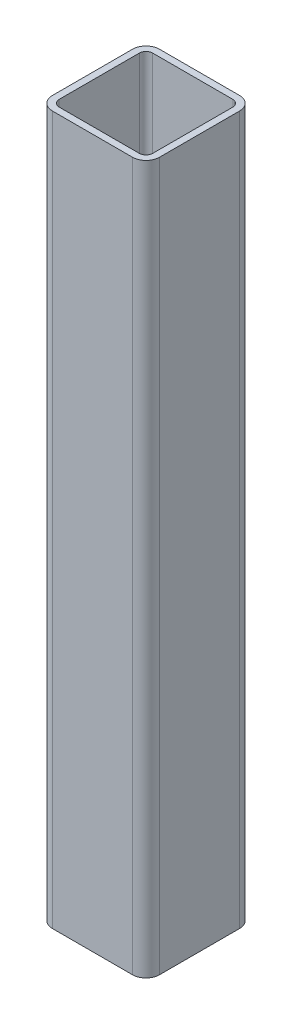
ISO-10303-21;
HEADER;
FILE_DESCRIPTION(('STEP AP214'),'2;1');
FILE_NAME('part.step','',(''),(''),'','','');
FILE_SCHEMA(('AUTOMOTIVE_DESIGN { 1 0 10303 214 1 1 1 1 }'));
ENDSEC;
DATA;
#1=APPLICATION_CONTEXT('core data for automotive mechanical design processes');
#2=APPLICATION_PROTOCOL_DEFINITION('international standard','automotive_design',2000,#1);
#3=PRODUCT_CONTEXT('',#1,'mechanical');
#4=PRODUCT('Part','Part','',(#3));
#5=PRODUCT_RELATED_PRODUCT_CATEGORY('part','',(#4));
#6=PRODUCT_DEFINITION_FORMATION('','',#4);
#7=PRODUCT_DEFINITION_CONTEXT('part definition',#1,'design');
#8=PRODUCT_DEFINITION('design','',#6,#7);
#9=PRODUCT_DEFINITION_SHAPE('','',#8);
#10=(LENGTH_UNIT() NAMED_UNIT(*) SI_UNIT(.MILLI.,.METRE.));
#11=(NAMED_UNIT(*) PLANE_ANGLE_UNIT() SI_UNIT($,.RADIAN.));
#12=(NAMED_UNIT(*) SI_UNIT($,.STERADIAN.) SOLID_ANGLE_UNIT());
#13=UNCERTAINTY_MEASURE_WITH_UNIT(LENGTH_MEASURE(1.E-05),#10,'distance_accuracy_value','');
#14=(GEOMETRIC_REPRESENTATION_CONTEXT(3) GLOBAL_UNCERTAINTY_ASSIGNED_CONTEXT((#13)) GLOBAL_UNIT_ASSIGNED_CONTEXT((#10,
#11,#12)) REPRESENTATION_CONTEXT('',''));
#15=CARTESIAN_POINT('',(0.,0.,0.));
#16=DIRECTION('',(0.,0.,1.));
#17=DIRECTION('',(1.,0.,0.));
#18=AXIS2_PLACEMENT_3D('',#15,#16,#17);
#19=CARTESIAN_POINT('',(11.875,210.,-11.875));
#20=DIRECTION('',(0.,-1.,0.));
#21=DIRECTION('',(0.,0.,-1.));
#22=AXIS2_PLACEMENT_3D('',#19,#20,#21);
#23=CYLINDRICAL_SURFACE('',#22,4.);
#24=CARTESIAN_POINT('',(11.875,0.,-11.875));
#25=DIRECTION('',(0.,1.,0.));
#26=DIRECTION('',(0.,0.,1.));
#27=AXIS2_PLACEMENT_3D('',#24,#25,#26);
#28=CIRCLE('',#27,4.);
#29=CARTESIAN_POINT('',(15.875,0.,-11.875));
#30=VERTEX_POINT('',#29);
#31=CARTESIAN_POINT('',(11.875,0.,-15.875));
#32=VERTEX_POINT('',#31);
#33=EDGE_CURVE('E239',#30,#32,#28,.T.);
#34=ORIENTED_EDGE('',*,*,#33,.T.);
#35=DIRECTION('',(0.,-1.,0.));
#36=VECTOR('',#35,1.);
#37=CARTESIAN_POINT('',(11.875,210.,-15.875));
#38=LINE('',#37,#36);
#39=CARTESIAN_POINT('',(11.875,210.,-15.875));
#40=VERTEX_POINT('',#39);
#41=EDGE_CURVE('E12',#40,#32,#38,.T.);
#42=ORIENTED_EDGE('',*,*,#41,.F.);
#43=CARTESIAN_POINT('',(11.875,210.,-11.875));
#44=DIRECTION('',(0.,1.,0.));
#45=DIRECTION('',(0.,0.,1.));
#46=AXIS2_PLACEMENT_3D('',#43,#44,#45);
#47=CIRCLE('',#46,4.);
#48=CARTESIAN_POINT('',(15.875,210.,-11.875));
#49=VERTEX_POINT('',#48);
#50=EDGE_CURVE('E317',#49,#40,#47,.T.);
#51=ORIENTED_EDGE('',*,*,#50,.F.);
#52=DIRECTION('',(0.,-1.,0.));
#53=VECTOR('',#52,1.);
#54=CARTESIAN_POINT('',(15.875,210.,-11.875));
#55=LINE('',#54,#53);
#56=EDGE_CURVE('E254',#49,#30,#55,.T.);
#57=ORIENTED_EDGE('',*,*,#56,.T.);
#58=EDGE_LOOP('',(#34,#42,#51,#57));
#59=FACE_BOUND('',#58,.T.);
#60=ADVANCED_FACE('F67',(#59),#23,.T.);
#61=CARTESIAN_POINT('',(11.875,210.,-15.875));
#62=DIRECTION('',(0.,0.,1.));
#63=DIRECTION('',(1.,0.,0.));
#64=AXIS2_PLACEMENT_3D('',#61,#62,#63);
#65=PLANE('',#64);
#66=DIRECTION('',(-1.,0.,0.));
#67=VECTOR('',#66,1.);
#68=CARTESIAN_POINT('',(11.875,0.,-15.875));
#69=LINE('',#68,#67);
#70=CARTESIAN_POINT('',(-11.875,0.,-15.875));
#71=VERTEX_POINT('',#70);
#72=EDGE_CURVE('E242',#32,#71,#69,.T.);
#73=ORIENTED_EDGE('',*,*,#72,.T.);
#74=DIRECTION('',(0.,-1.,0.));
#75=VECTOR('',#74,1.);
#76=CARTESIAN_POINT('',(-11.875,210.,-15.875));
#77=LINE('',#76,#75);
#78=CARTESIAN_POINT('',(-11.875,210.,-15.875));
#79=VERTEX_POINT('',#78);
#80=EDGE_CURVE('E77',#79,#71,#77,.T.);
#81=ORIENTED_EDGE('',*,*,#80,.F.);
#82=DIRECTION('',(-1.,0.,0.));
#83=VECTOR('',#82,1.);
#84=CARTESIAN_POINT('',(11.875,210.,-15.875));
#85=LINE('',#84,#83);
#86=EDGE_CURVE('E319',#40,#79,#85,.T.);
#87=ORIENTED_EDGE('',*,*,#86,.F.);
#88=ORIENTED_EDGE('',*,*,#41,.T.);
#89=EDGE_LOOP('',(#73,#81,#87,#88));
#90=FACE_BOUND('',#89,.T.);
#91=ADVANCED_FACE('F354',(#90),#65,.F.);
#92=CARTESIAN_POINT('',(-11.875,210.,-11.875));
#93=DIRECTION('',(0.,-1.,0.));
#94=DIRECTION('',(0.,0.,-1.));
#95=AXIS2_PLACEMENT_3D('',#92,#93,#94);
#96=CYLINDRICAL_SURFACE('',#95,4.);
#97=CARTESIAN_POINT('',(-11.875,0.,-11.875));
#98=DIRECTION('',(0.,1.,0.));
#99=DIRECTION('',(0.,0.,1.));
#100=AXIS2_PLACEMENT_3D('',#97,#98,#99);
#101=CIRCLE('',#100,4.);
#102=CARTESIAN_POINT('',(-15.875,0.,-11.875));
#103=VERTEX_POINT('',#102);
#104=EDGE_CURVE('E244',#71,#103,#101,.T.);
#105=ORIENTED_EDGE('',*,*,#104,.T.);
#106=DIRECTION('',(0.,-1.,0.));
#107=VECTOR('',#106,1.);
#108=CARTESIAN_POINT('',(-15.875,210.,-11.875));
#109=LINE('',#108,#107);
#110=CARTESIAN_POINT('',(-15.875,210.,-11.875));
#111=VERTEX_POINT('',#110);
#112=EDGE_CURVE('E261',#111,#103,#109,.T.);
#113=ORIENTED_EDGE('',*,*,#112,.F.);
#114=CARTESIAN_POINT('',(-11.875,210.,-11.875));
#115=DIRECTION('',(0.,1.,0.));
#116=DIRECTION('',(0.,0.,1.));
#117=AXIS2_PLACEMENT_3D('',#114,#115,#116);
#118=CIRCLE('',#117,4.);
#119=EDGE_CURVE('E321',#79,#111,#118,.T.);
#120=ORIENTED_EDGE('',*,*,#119,.F.);
#121=ORIENTED_EDGE('',*,*,#80,.T.);
#122=EDGE_LOOP('',(#105,#113,#120,#121));
#123=FACE_BOUND('',#122,.T.);
#124=ADVANCED_FACE('F359',(#123),#96,.T.);
#125=CARTESIAN_POINT('',(-15.875,210.,11.875));
#126=DIRECTION('',(1.,0.,0.));
#127=DIRECTION('',(0.,0.,-1.));
#128=AXIS2_PLACEMENT_3D('',#125,#126,#127);
#129=PLANE('',#128);
#130=DIRECTION('',(0.,0.,1.));
#131=VECTOR('',#130,1.);
#132=CARTESIAN_POINT('',(-15.875,0.,11.875));
#133=LINE('',#132,#131);
#134=CARTESIAN_POINT('',(-15.875,0.,11.875));
#135=VERTEX_POINT('',#134);
#136=EDGE_CURVE('E246',#103,#135,#133,.T.);
#137=ORIENTED_EDGE('',*,*,#136,.T.);
#138=DIRECTION('',(0.,-1.,0.));
#139=VECTOR('',#138,1.);
#140=CARTESIAN_POINT('',(-15.875,210.,11.875));
#141=LINE('',#140,#139);
#142=CARTESIAN_POINT('',(-15.875,210.,11.875));
#143=VERTEX_POINT('',#142);
#144=EDGE_CURVE('E258',#143,#135,#141,.T.);
#145=ORIENTED_EDGE('',*,*,#144,.F.);
#146=DIRECTION('',(0.,0.,1.));
#147=VECTOR('',#146,1.);
#148=CARTESIAN_POINT('',(-15.875,210.,11.875));
#149=LINE('',#148,#147);
#150=EDGE_CURVE('E323',#111,#143,#149,.T.);
#151=ORIENTED_EDGE('',*,*,#150,.F.);
#152=ORIENTED_EDGE('',*,*,#112,.T.);
#153=EDGE_LOOP('',(#137,#145,#151,#152));
#154=FACE_BOUND('',#153,.T.);
#155=ADVANCED_FACE('F329',(#154),#129,.F.);
#156=CARTESIAN_POINT('',(-11.875,210.,11.875));
#157=DIRECTION('',(0.,-1.,0.));
#158=DIRECTION('',(0.,0.,-1.));
#159=AXIS2_PLACEMENT_3D('',#156,#157,#158);
#160=CYLINDRICAL_SURFACE('',#159,4.);
#161=CARTESIAN_POINT('',(-11.875,0.,11.875));
#162=DIRECTION('',(0.,1.,0.));
#163=DIRECTION('',(0.,0.,1.));
#164=AXIS2_PLACEMENT_3D('',#161,#162,#163);
#165=CIRCLE('',#164,4.);
#166=CARTESIAN_POINT('',(-11.875,0.,15.875));
#167=VERTEX_POINT('',#166);
#168=EDGE_CURVE('E248',#135,#167,#165,.T.);
#169=ORIENTED_EDGE('',*,*,#168,.T.);
#170=DIRECTION('',(0.,-1.,0.));
#171=VECTOR('',#170,1.);
#172=CARTESIAN_POINT('',(-11.875,210.,15.875));
#173=LINE('',#172,#171);
#174=CARTESIAN_POINT('',(-11.875,210.,15.875));
#175=VERTEX_POINT('',#174);
#176=EDGE_CURVE('E206',#175,#167,#173,.T.);
#177=ORIENTED_EDGE('',*,*,#176,.F.);
#178=CARTESIAN_POINT('',(-11.875,210.,11.875));
#179=DIRECTION('',(0.,1.,0.));
#180=DIRECTION('',(0.,0.,1.));
#181=AXIS2_PLACEMENT_3D('',#178,#179,#180);
#182=CIRCLE('',#181,4.);
#183=EDGE_CURVE('E197',#143,#175,#182,.T.);
#184=ORIENTED_EDGE('',*,*,#183,.F.);
#185=ORIENTED_EDGE('',*,*,#144,.T.);
#186=EDGE_LOOP('',(#169,#177,#184,#185));
#187=FACE_BOUND('',#186,.T.);
#188=ADVANCED_FACE('F333',(#187),#160,.T.);
#189=CARTESIAN_POINT('',(-11.875,210.,15.875));
#190=DIRECTION('',(0.,0.,-1.));
#191=DIRECTION('',(-1.,0.,0.));
#192=AXIS2_PLACEMENT_3D('',#189,#190,#191);
#193=PLANE('',#192);
#194=DIRECTION('',(1.,0.,0.));
#195=VECTOR('',#194,1.);
#196=CARTESIAN_POINT('',(-11.875,0.,15.875));
#197=LINE('',#196,#195);
#198=CARTESIAN_POINT('',(11.875,0.,15.875));
#199=VERTEX_POINT('',#198);
#200=EDGE_CURVE('E205',#167,#199,#197,.T.);
#201=ORIENTED_EDGE('',*,*,#200,.T.);
#202=DIRECTION('',(0.,-1.,0.));
#203=VECTOR('',#202,1.);
#204=CARTESIAN_POINT('',(11.875,210.,15.875));
#205=LINE('',#204,#203);
#206=CARTESIAN_POINT('',(11.875,210.,15.875));
#207=VERTEX_POINT('',#206);
#208=EDGE_CURVE('E202',#207,#199,#205,.T.);
#209=ORIENTED_EDGE('',*,*,#208,.F.);
#210=DIRECTION('',(1.,0.,0.));
#211=VECTOR('',#210,1.);
#212=CARTESIAN_POINT('',(-11.875,210.,15.875));
#213=LINE('',#212,#211);
#214=EDGE_CURVE('E191',#175,#207,#213,.T.);
#215=ORIENTED_EDGE('',*,*,#214,.F.);
#216=ORIENTED_EDGE('',*,*,#176,.T.);
#217=EDGE_LOOP('',(#201,#209,#215,#216));
#218=FACE_BOUND('',#217,.T.);
#219=ADVANCED_FACE('F203',(#218),#193,.F.);
#220=CARTESIAN_POINT('',(11.875,210.,11.875));
#221=DIRECTION('',(0.,-1.,0.));
#222=DIRECTION('',(0.,0.,-1.));
#223=AXIS2_PLACEMENT_3D('',#220,#221,#222);
#224=CYLINDRICAL_SURFACE('',#223,4.);
#225=CARTESIAN_POINT('',(11.875,0.,11.875));
#226=DIRECTION('',(0.,1.,0.));
#227=DIRECTION('',(0.,0.,1.));
#228=AXIS2_PLACEMENT_3D('',#225,#226,#227);
#229=CIRCLE('',#228,4.);
#230=CARTESIAN_POINT('',(15.875,0.,11.875));
#231=VERTEX_POINT('',#230);
#232=EDGE_CURVE('E139',#199,#231,#229,.T.);
#233=ORIENTED_EDGE('',*,*,#232,.T.);
#234=DIRECTION('',(0.,-1.,0.));
#235=VECTOR('',#234,1.);
#236=CARTESIAN_POINT('',(15.875,210.,11.875));
#237=LINE('',#236,#235);
#238=CARTESIAN_POINT('',(15.875,210.,11.875));
#239=VERTEX_POINT('',#238);
#240=EDGE_CURVE('E207',#239,#231,#237,.T.);
#241=ORIENTED_EDGE('',*,*,#240,.F.);
#242=CARTESIAN_POINT('',(11.875,210.,11.875));
#243=DIRECTION('',(0.,1.,0.));
#244=DIRECTION('',(0.,0.,1.));
#245=AXIS2_PLACEMENT_3D('',#242,#243,#244);
#246=CIRCLE('',#245,4.);
#247=EDGE_CURVE('E195',#207,#239,#246,.T.);
#248=ORIENTED_EDGE('',*,*,#247,.F.);
#249=ORIENTED_EDGE('',*,*,#208,.T.);
#250=EDGE_LOOP('',(#233,#241,#248,#249));
#251=FACE_BOUND('',#250,.T.);
#252=ADVANCED_FACE('F209',(#251),#224,.T.);
#253=CARTESIAN_POINT('',(-11.875,210.,-11.875));
#254=DIRECTION('',(0.,-1.,0.));
#255=DIRECTION('',(0.,0.,-1.));
#256=AXIS2_PLACEMENT_3D('',#253,#254,#255);
#257=CYLINDRICAL_SURFACE('',#256,1.99999999999999);
#258=CARTESIAN_POINT('',(-11.875,0.,-11.875));
#259=DIRECTION('',(0.,1.,0.));
#260=DIRECTION('',(0.,0.,1.));
#261=AXIS2_PLACEMENT_3D('',#258,#259,#260);
#262=CIRCLE('',#261,1.99999999999999);
#263=CARTESIAN_POINT('',(-11.875,0.,-13.875));
#264=VERTEX_POINT('',#263);
#265=CARTESIAN_POINT('',(-13.875,0.,-11.875));
#266=VERTEX_POINT('',#265);
#267=EDGE_CURVE('E215',#264,#266,#262,.T.);
#268=ORIENTED_EDGE('',*,*,#267,.F.);
#269=DIRECTION('',(0.,-1.,0.));
#270=VECTOR('',#269,1.);
#271=CARTESIAN_POINT('',(-11.875,210.,-13.875));
#272=LINE('',#271,#270);
#273=CARTESIAN_POINT('',(-11.875,210.,-13.875));
#274=VERTEX_POINT('',#273);
#275=EDGE_CURVE('E71',#274,#264,#272,.T.);
#276=ORIENTED_EDGE('',*,*,#275,.F.);
#277=CARTESIAN_POINT('',(-11.875,210.,-11.875));
#278=DIRECTION('',(0.,1.,0.));
#279=DIRECTION('',(0.,0.,1.));
#280=AXIS2_PLACEMENT_3D('',#277,#278,#279);
#281=CIRCLE('',#280,1.99999999999999);
#282=CARTESIAN_POINT('',(-13.875,210.,-11.875));
#283=VERTEX_POINT('',#282);
#284=EDGE_CURVE('E253',#274,#283,#281,.T.);
#285=ORIENTED_EDGE('',*,*,#284,.T.);
#286=DIRECTION('',(0.,-1.,0.));
#287=VECTOR('',#286,1.);
#288=CARTESIAN_POINT('',(-13.875,210.,-11.875));
#289=LINE('',#288,#287);
#290=EDGE_CURVE('E211',#283,#266,#289,.T.);
#291=ORIENTED_EDGE('',*,*,#290,.T.);
#292=EDGE_LOOP('',(#268,#276,#285,#291));
#293=FACE_BOUND('',#292,.T.);
#294=ADVANCED_FACE('F69',(#293),#257,.F.);
#295=CARTESIAN_POINT('',(11.875,210.,-13.875));
#296=DIRECTION('',(0.,0.,1.));
#297=DIRECTION('',(1.,0.,0.));
#298=AXIS2_PLACEMENT_3D('',#295,#296,#297);
#299=PLANE('',#298);
#300=DIRECTION('',(-1.,0.,0.));
#301=VECTOR('',#300,1.);
#302=CARTESIAN_POINT('',(11.875,0.,-13.875));
#303=LINE('',#302,#301);
#304=CARTESIAN_POINT('',(11.875,0.,-13.875));
#305=VERTEX_POINT('',#304);
#306=EDGE_CURVE('E218',#305,#264,#303,.T.);
#307=ORIENTED_EDGE('',*,*,#306,.F.);
#308=DIRECTION('',(0.,-1.,0.));
#309=VECTOR('',#308,1.);
#310=CARTESIAN_POINT('',(11.875,210.,-13.875));
#311=LINE('',#310,#309);
#312=CARTESIAN_POINT('',(11.875,210.,-13.875));
#313=VERTEX_POINT('',#312);
#314=EDGE_CURVE('E276',#313,#305,#311,.T.);
#315=ORIENTED_EDGE('',*,*,#314,.F.);
#316=DIRECTION('',(-1.,0.,0.));
#317=VECTOR('',#316,1.);
#318=CARTESIAN_POINT('',(11.875,210.,-13.875));
#319=LINE('',#318,#317);
#320=EDGE_CURVE('E285',#313,#274,#319,.T.);
#321=ORIENTED_EDGE('',*,*,#320,.T.);
#322=ORIENTED_EDGE('',*,*,#275,.T.);
#323=EDGE_LOOP('',(#307,#315,#321,#322));
#324=FACE_BOUND('',#323,.T.);
#325=ADVANCED_FACE('F283',(#324),#299,.T.);
#326=CARTESIAN_POINT('',(11.875,210.,-11.875));
#327=DIRECTION('',(0.,-1.,0.));
#328=DIRECTION('',(0.,0.,-1.));
#329=AXIS2_PLACEMENT_3D('',#326,#327,#328);
#330=CYLINDRICAL_SURFACE('',#329,1.99999999999999);
#331=CARTESIAN_POINT('',(11.875,0.,-11.875));
#332=DIRECTION('',(0.,1.,0.));
#333=DIRECTION('',(0.,0.,1.));
#334=AXIS2_PLACEMENT_3D('',#331,#332,#333);
#335=CIRCLE('',#334,1.99999999999999);
#336=CARTESIAN_POINT('',(13.875,0.,-11.875));
#337=VERTEX_POINT('',#336);
#338=EDGE_CURVE('E221',#337,#305,#335,.T.);
#339=ORIENTED_EDGE('',*,*,#338,.F.);
#340=DIRECTION('',(0.,-1.,0.));
#341=VECTOR('',#340,1.);
#342=CARTESIAN_POINT('',(13.875,210.,-11.875));
#343=LINE('',#342,#341);
#344=CARTESIAN_POINT('',(13.875,210.,-11.875));
#345=VERTEX_POINT('',#344);
#346=EDGE_CURVE('E275',#345,#337,#343,.T.);
#347=ORIENTED_EDGE('',*,*,#346,.F.);
#348=CARTESIAN_POINT('',(11.875,210.,-11.875));
#349=DIRECTION('',(0.,1.,0.));
#350=DIRECTION('',(0.,0.,1.));
#351=AXIS2_PLACEMENT_3D('',#348,#349,#350);
#352=CIRCLE('',#351,1.99999999999999);
#353=EDGE_CURVE('E293',#345,#313,#352,.T.);
#354=ORIENTED_EDGE('',*,*,#353,.T.);
#355=ORIENTED_EDGE('',*,*,#314,.T.);
#356=EDGE_LOOP('',(#339,#347,#354,#355));
#357=FACE_BOUND('',#356,.T.);
#358=ADVANCED_FACE('F291',(#357),#330,.F.);
#359=CARTESIAN_POINT('',(13.875,210.,-11.875));
#360=DIRECTION('',(-1.,0.,0.));
#361=DIRECTION('',(0.,0.,1.));
#362=AXIS2_PLACEMENT_3D('',#359,#360,#361);
#363=PLANE('',#362);
#364=DIRECTION('',(0.,0.,-1.));
#365=VECTOR('',#364,1.);
#366=CARTESIAN_POINT('',(13.875,0.,-11.875));
#367=LINE('',#366,#365);
#368=CARTESIAN_POINT('',(13.875,0.,11.875));
#369=VERTEX_POINT('',#368);
#370=EDGE_CURVE('E224',#369,#337,#367,.T.);
#371=ORIENTED_EDGE('',*,*,#370,.F.);
#372=DIRECTION('',(0.,-1.,0.));
#373=VECTOR('',#372,1.);
#374=CARTESIAN_POINT('',(13.875,210.,11.875));
#375=LINE('',#374,#373);
#376=CARTESIAN_POINT('',(13.875,210.,11.875));
#377=VERTEX_POINT('',#376);
#378=EDGE_CURVE('E273',#377,#369,#375,.T.);
#379=ORIENTED_EDGE('',*,*,#378,.F.);
#380=DIRECTION('',(0.,0.,-1.));
#381=VECTOR('',#380,1.);
#382=CARTESIAN_POINT('',(13.875,210.,-11.875));
#383=LINE('',#382,#381);
#384=EDGE_CURVE('E299',#377,#345,#383,.T.);
#385=ORIENTED_EDGE('',*,*,#384,.T.);
#386=ORIENTED_EDGE('',*,*,#346,.T.);
#387=EDGE_LOOP('',(#371,#379,#385,#386));
#388=FACE_BOUND('',#387,.T.);
#389=ADVANCED_FACE('F302',(#388),#363,.T.);
#390=CARTESIAN_POINT('',(11.875,210.,11.875));
#391=DIRECTION('',(0.,-1.,0.));
#392=DIRECTION('',(0.,0.,-1.));
#393=AXIS2_PLACEMENT_3D('',#390,#391,#392);
#394=CYLINDRICAL_SURFACE('',#393,1.99999999999999);
#395=CARTESIAN_POINT('',(11.875,0.,11.875));
#396=DIRECTION('',(0.,1.,0.));
#397=DIRECTION('',(0.,0.,1.));
#398=AXIS2_PLACEMENT_3D('',#395,#396,#397);
#399=CIRCLE('',#398,1.99999999999999);
#400=CARTESIAN_POINT('',(11.875,0.,13.875));
#401=VERTEX_POINT('',#400);
#402=EDGE_CURVE('E227',#401,#369,#399,.T.);
#403=ORIENTED_EDGE('',*,*,#402,.F.);
#404=DIRECTION('',(0.,-1.,0.));
#405=VECTOR('',#404,1.);
#406=CARTESIAN_POINT('',(11.875,210.,13.875));
#407=LINE('',#406,#405);
#408=CARTESIAN_POINT('',(11.875,210.,13.875));
#409=VERTEX_POINT('',#408);
#410=EDGE_CURVE('E271',#409,#401,#407,.T.);
#411=ORIENTED_EDGE('',*,*,#410,.F.);
#412=CARTESIAN_POINT('',(11.875,210.,11.875));
#413=DIRECTION('',(0.,1.,0.));
#414=DIRECTION('',(0.,0.,1.));
#415=AXIS2_PLACEMENT_3D('',#412,#413,#414);
#416=CIRCLE('',#415,1.99999999999999);
#417=EDGE_CURVE('E303',#409,#377,#416,.T.);
#418=ORIENTED_EDGE('',*,*,#417,.T.);
#419=ORIENTED_EDGE('',*,*,#378,.T.);
#420=EDGE_LOOP('',(#403,#411,#418,#419));
#421=FACE_BOUND('',#420,.T.);
#422=ADVANCED_FACE('F370',(#421),#394,.F.);
#423=CARTESIAN_POINT('',(-11.875,210.,13.875));
#424=DIRECTION('',(0.,0.,-1.));
#425=DIRECTION('',(-1.,0.,0.));
#426=AXIS2_PLACEMENT_3D('',#423,#424,#425);
#427=PLANE('',#426);
#428=DIRECTION('',(1.,0.,0.));
#429=VECTOR('',#428,1.);
#430=CARTESIAN_POINT('',(-11.875,0.,13.875));
#431=LINE('',#430,#429);
#432=CARTESIAN_POINT('',(-11.875,0.,13.875));
#433=VERTEX_POINT('',#432);
#434=EDGE_CURVE('E230',#433,#401,#431,.T.);
#435=ORIENTED_EDGE('',*,*,#434,.F.);
#436=DIRECTION('',(0.,-1.,0.));
#437=VECTOR('',#436,1.);
#438=CARTESIAN_POINT('',(-11.875,210.,13.875));
#439=LINE('',#438,#437);
#440=CARTESIAN_POINT('',(-11.875,210.,13.875));
#441=VERTEX_POINT('',#440);
#442=EDGE_CURVE('E269',#441,#433,#439,.T.);
#443=ORIENTED_EDGE('',*,*,#442,.F.);
#444=DIRECTION('',(1.,0.,0.));
#445=VECTOR('',#444,1.);
#446=CARTESIAN_POINT('',(-11.875,210.,13.875));
#447=LINE('',#446,#445);
#448=EDGE_CURVE('E305',#441,#409,#447,.T.);
#449=ORIENTED_EDGE('',*,*,#448,.T.);
#450=ORIENTED_EDGE('',*,*,#410,.T.);
#451=EDGE_LOOP('',(#435,#443,#449,#450));
#452=FACE_BOUND('',#451,.T.);
#453=ADVANCED_FACE('F366',(#452),#427,.T.);
#454=CARTESIAN_POINT('',(-11.875,210.,11.875));
#455=DIRECTION('',(0.,-1.,0.));
#456=DIRECTION('',(0.,0.,-1.));
#457=AXIS2_PLACEMENT_3D('',#454,#455,#456);
#458=CYLINDRICAL_SURFACE('',#457,1.99999999999999);
#459=CARTESIAN_POINT('',(-11.875,0.,11.875));
#460=DIRECTION('',(0.,1.,0.));
#461=DIRECTION('',(0.,0.,1.));
#462=AXIS2_PLACEMENT_3D('',#459,#460,#461);
#463=CIRCLE('',#462,1.99999999999999);
#464=CARTESIAN_POINT('',(-13.875,0.,11.875));
#465=VERTEX_POINT('',#464);
#466=EDGE_CURVE('E233',#465,#433,#463,.T.);
#467=ORIENTED_EDGE('',*,*,#466,.F.);
#468=DIRECTION('',(0.,-1.,0.));
#469=VECTOR('',#468,1.);
#470=CARTESIAN_POINT('',(-13.875,210.,11.875));
#471=LINE('',#470,#469);
#472=CARTESIAN_POINT('',(-13.875,210.,11.875));
#473=VERTEX_POINT('',#472);
#474=EDGE_CURVE('E267',#473,#465,#471,.T.);
#475=ORIENTED_EDGE('',*,*,#474,.F.);
#476=CARTESIAN_POINT('',(-11.875,210.,11.875));
#477=DIRECTION('',(0.,1.,0.));
#478=DIRECTION('',(0.,0.,1.));
#479=AXIS2_PLACEMENT_3D('',#476,#477,#478);
#480=CIRCLE('',#479,1.99999999999999);
#481=EDGE_CURVE('E311',#473,#441,#480,.T.);
#482=ORIENTED_EDGE('',*,*,#481,.T.);
#483=ORIENTED_EDGE('',*,*,#442,.T.);
#484=EDGE_LOOP('',(#467,#475,#482,#483));
#485=FACE_BOUND('',#484,.T.);
#486=ADVANCED_FACE('F348',(#485),#458,.F.);
#487=CARTESIAN_POINT('',(-13.875,210.,11.875));
#488=DIRECTION('',(1.,0.,0.));
#489=DIRECTION('',(0.,0.,-1.));
#490=AXIS2_PLACEMENT_3D('',#487,#488,#489);
#491=PLANE('',#490);
#492=DIRECTION('',(0.,0.,1.));
#493=VECTOR('',#492,1.);
#494=CARTESIAN_POINT('',(-13.875,0.,11.875));
#495=LINE('',#494,#493);
#496=EDGE_CURVE('E236',#266,#465,#495,.T.);
#497=ORIENTED_EDGE('',*,*,#496,.F.);
#498=ORIENTED_EDGE('',*,*,#290,.F.);
#499=DIRECTION('',(0.,0.,1.));
#500=VECTOR('',#499,1.);
#501=CARTESIAN_POINT('',(-13.875,210.,11.875));
#502=LINE('',#501,#500);
#503=EDGE_CURVE('E314',#283,#473,#502,.T.);
#504=ORIENTED_EDGE('',*,*,#503,.T.);
#505=ORIENTED_EDGE('',*,*,#474,.T.);
#506=EDGE_LOOP('',(#497,#498,#504,#505));
#507=FACE_BOUND('',#506,.T.);
#508=ADVANCED_FACE('F341',(#507),#491,.T.);
#509=CARTESIAN_POINT('',(15.875,210.,-11.875));
#510=DIRECTION('',(-1.,0.,0.));
#511=DIRECTION('',(0.,0.,1.));
#512=AXIS2_PLACEMENT_3D('',#509,#510,#511);
#513=PLANE('',#512);
#514=DIRECTION('',(0.,0.,-1.));
#515=VECTOR('',#514,1.);
#516=CARTESIAN_POINT('',(15.875,0.,-11.875));
#517=LINE('',#516,#515);
#518=EDGE_CURVE('E145',#231,#30,#517,.T.);
#519=ORIENTED_EDGE('',*,*,#518,.T.);
#520=ORIENTED_EDGE('',*,*,#56,.F.);
#521=DIRECTION('',(0.,0.,-1.));
#522=VECTOR('',#521,1.);
#523=CARTESIAN_POINT('',(15.875,210.,-11.875));
#524=LINE('',#523,#522);
#525=EDGE_CURVE('E86',#239,#49,#524,.T.);
#526=ORIENTED_EDGE('',*,*,#525,.F.);
#527=ORIENTED_EDGE('',*,*,#240,.T.);
#528=EDGE_LOOP('',(#519,#520,#526,#527));
#529=FACE_BOUND('',#528,.T.);
#530=ADVANCED_FACE('F339',(#529),#513,.F.);
#531=CARTESIAN_POINT('',(11.875,210.,-11.875));
#532=DIRECTION('',(0.,1.,0.));
#533=DIRECTION('',(0.,0.,1.));
#534=AXIS2_PLACEMENT_3D('',#531,#532,#533);
#535=PLANE('',#534);
#536=ORIENTED_EDGE('',*,*,#284,.F.);
#537=ORIENTED_EDGE('',*,*,#320,.F.);
#538=ORIENTED_EDGE('',*,*,#353,.F.);
#539=ORIENTED_EDGE('',*,*,#384,.F.);
#540=ORIENTED_EDGE('',*,*,#417,.F.);
#541=ORIENTED_EDGE('',*,*,#448,.F.);
#542=ORIENTED_EDGE('',*,*,#481,.F.);
#543=ORIENTED_EDGE('',*,*,#503,.F.);
#544=EDGE_LOOP('',(#536,#537,#538,#539,#540,#541,#542,#543));
#545=FACE_BOUND('',#544,.T.);
#546=ORIENTED_EDGE('',*,*,#50,.T.);
#547=ORIENTED_EDGE('',*,*,#86,.T.);
#548=ORIENTED_EDGE('',*,*,#119,.T.);
#549=ORIENTED_EDGE('',*,*,#150,.T.);
#550=ORIENTED_EDGE('',*,*,#183,.T.);
#551=ORIENTED_EDGE('',*,*,#214,.T.);
#552=ORIENTED_EDGE('',*,*,#247,.T.);
#553=ORIENTED_EDGE('',*,*,#525,.T.);
#554=EDGE_LOOP('',(#546,#547,#548,#549,#550,#551,#552,#553));
#555=FACE_BOUND('',#554,.T.);
#556=ADVANCED_FACE('F193',(#545,#555),#535,.T.);
#557=CARTESIAN_POINT('',(11.875,0.,-11.875));
#558=DIRECTION('',(0.,1.,0.));
#559=DIRECTION('',(0.,0.,1.));
#560=AXIS2_PLACEMENT_3D('',#557,#558,#559);
#561=PLANE('',#560);
#562=ORIENTED_EDGE('',*,*,#267,.T.);
#563=ORIENTED_EDGE('',*,*,#496,.T.);
#564=ORIENTED_EDGE('',*,*,#466,.T.);
#565=ORIENTED_EDGE('',*,*,#434,.T.);
#566=ORIENTED_EDGE('',*,*,#402,.T.);
#567=ORIENTED_EDGE('',*,*,#370,.T.);
#568=ORIENTED_EDGE('',*,*,#338,.T.);
#569=ORIENTED_EDGE('',*,*,#306,.T.);
#570=EDGE_LOOP('',(#562,#563,#564,#565,#566,#567,#568,#569));
#571=FACE_BOUND('',#570,.T.);
#572=ORIENTED_EDGE('',*,*,#33,.F.);
#573=ORIENTED_EDGE('',*,*,#518,.F.);
#574=ORIENTED_EDGE('',*,*,#232,.F.);
#575=ORIENTED_EDGE('',*,*,#200,.F.);
#576=ORIENTED_EDGE('',*,*,#168,.F.);
#577=ORIENTED_EDGE('',*,*,#136,.F.);
#578=ORIENTED_EDGE('',*,*,#104,.F.);
#579=ORIENTED_EDGE('',*,*,#72,.F.);
#580=EDGE_LOOP('',(#572,#573,#574,#575,#576,#577,#578,#579));
#581=FACE_BOUND('',#580,.T.);
#582=ADVANCED_FACE('F288',(#571,#581),#561,.F.);
#583=CLOSED_SHELL('',(#60,#91,#124,#155,#188,#219,#252,#294,#325,#358,#389,#422,#453,#486,#508,
#530,#556,#582));
#584=MANIFOLD_SOLID_BREP('B2',#583);
#585=ADVANCED_BREP_SHAPE_REPRESENTATION('',(#18,#584),#14);
#586=SHAPE_DEFINITION_REPRESENTATION(#9,#585);
ENDSEC;
END-ISO-10303-21;
